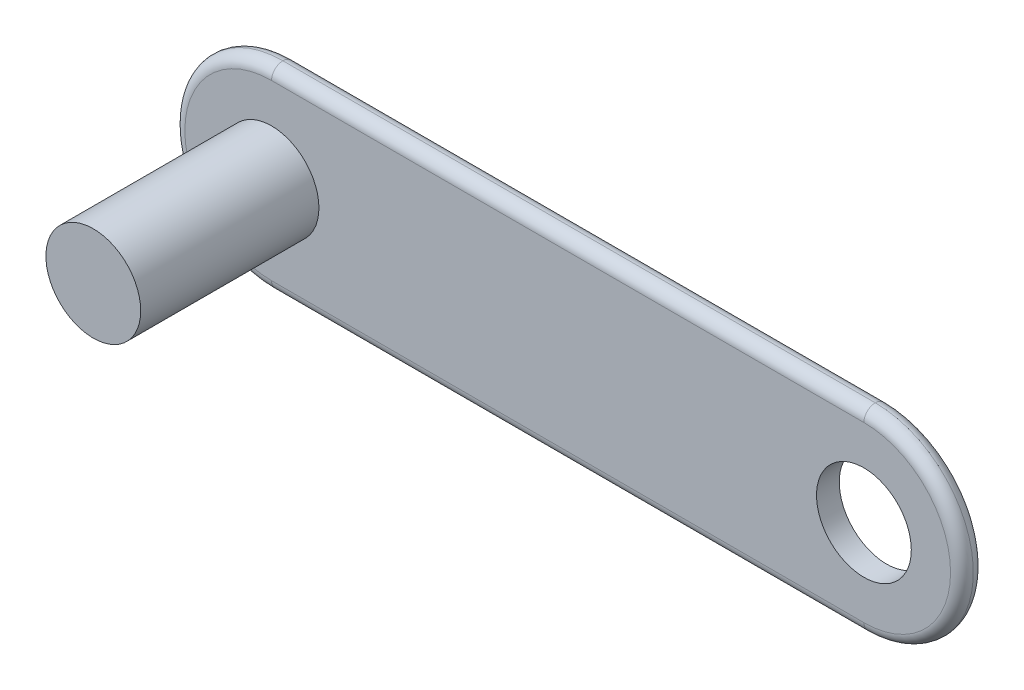
ISO-10303-21;
HEADER;
FILE_DESCRIPTION(('STEP AP214'),'2;1');
FILE_NAME('part.step','',(''),(''),'','','');
FILE_SCHEMA(('AUTOMOTIVE_DESIGN { 1 0 10303 214 1 1 1 1 }'));
ENDSEC;
DATA;
#1=APPLICATION_CONTEXT('core data for automotive mechanical design processes');
#2=APPLICATION_PROTOCOL_DEFINITION('international standard','automotive_design',2000,#1);
#3=PRODUCT_CONTEXT('',#1,'mechanical');
#4=PRODUCT('Part','Part','',(#3));
#5=PRODUCT_RELATED_PRODUCT_CATEGORY('part','',(#4));
#6=PRODUCT_DEFINITION_FORMATION('','',#4);
#7=PRODUCT_DEFINITION_CONTEXT('part definition',#1,'design');
#8=PRODUCT_DEFINITION('design','',#6,#7);
#9=PRODUCT_DEFINITION_SHAPE('','',#8);
#10=(LENGTH_UNIT() NAMED_UNIT(*) SI_UNIT(.MILLI.,.METRE.));
#11=(NAMED_UNIT(*) PLANE_ANGLE_UNIT() SI_UNIT($,.RADIAN.));
#12=(NAMED_UNIT(*) SI_UNIT($,.STERADIAN.) SOLID_ANGLE_UNIT());
#13=UNCERTAINTY_MEASURE_WITH_UNIT(LENGTH_MEASURE(1.E-05),#10,'distance_accuracy_value','');
#14=(GEOMETRIC_REPRESENTATION_CONTEXT(3) GLOBAL_UNCERTAINTY_ASSIGNED_CONTEXT((#13)) GLOBAL_UNIT_ASSIGNED_CONTEXT((#10,
#11,#12)) REPRESENTATION_CONTEXT('',''));
#15=CARTESIAN_POINT('',(0.,0.,0.));
#16=DIRECTION('',(0.,0.,1.));
#17=DIRECTION('',(1.,0.,0.));
#18=AXIS2_PLACEMENT_3D('',#15,#16,#17);
#19=CARTESIAN_POINT('',(0.,0.,1.524));
#20=DIRECTION('',(0.,0.,1.));
#21=DIRECTION('',(1.,0.,0.));
#22=AXIS2_PLACEMENT_3D('',#19,#20,#21);
#23=PLANE('',#22);
#24=CARTESIAN_POINT('',(79.3591961348812,0.,1.524));
#25=DIRECTION('',(0.,0.,1.));
#26=DIRECTION('',(1.,0.,0.));
#27=AXIS2_PLACEMENT_3D('',#24,#25,#26);
#28=CIRCLE('',#27,6.35);
#29=CARTESIAN_POINT('',(85.7091961348812,0.,1.524));
#30=VERTEX_POINT('',#29);
#31=EDGE_CURVE('E170',#30,#30,#28,.T.);
#32=ORIENTED_EDGE('',*,*,#31,.F.);
#33=EDGE_LOOP('',(#32));
#34=FACE_BOUND('',#33,.T.);
#35=CARTESIAN_POINT('',(0.,0.,1.524));
#36=DIRECTION('',(0.,0.,1.));
#37=DIRECTION('',(1.,0.,0.));
#38=AXIS2_PLACEMENT_3D('',#35,#36,#37);
#39=CIRCLE('',#38,6.35);
#40=CARTESIAN_POINT('',(6.35,0.,1.524));
#41=VERTEX_POINT('',#40);
#42=EDGE_CURVE('E43',#41,#41,#39,.F.);
#43=ORIENTED_EDGE('',*,*,#42,.T.);
#44=EDGE_LOOP('',(#43));
#45=FACE_BOUND('',#44,.T.);
#46=DIRECTION('',(1.,0.,0.));
#47=VECTOR('',#46,1.);
#48=CARTESIAN_POINT('',(79.3591961348812,-11.6113152223252,1.524));
#49=LINE('',#48,#47);
#50=CARTESIAN_POINT('',(0.,-11.6113152223252,1.524));
#51=VERTEX_POINT('',#50);
#52=CARTESIAN_POINT('',(79.3591961348812,-11.6113152223252,1.524));
#53=VERTEX_POINT('',#52);
#54=EDGE_CURVE('E50',#51,#53,#49,.T.);
#55=ORIENTED_EDGE('',*,*,#54,.T.);
#56=CARTESIAN_POINT('',(79.3591961348812,0.,1.524));
#57=DIRECTION('',(0.,0.,1.));
#58=DIRECTION('',(1.,0.,0.));
#59=AXIS2_PLACEMENT_3D('',#56,#57,#58);
#60=CIRCLE('',#59,11.6113152223252);
#61=CARTESIAN_POINT('',(79.3591961348812,11.6113152223252,1.524));
#62=VERTEX_POINT('',#61);
#63=EDGE_CURVE('E11',#53,#62,#60,.T.);
#64=ORIENTED_EDGE('',*,*,#63,.T.);
#65=DIRECTION('',(-1.,0.,0.));
#66=VECTOR('',#65,1.);
#67=CARTESIAN_POINT('',(0.,11.6113152223252,1.524));
#68=LINE('',#67,#66);
#69=CARTESIAN_POINT('',(0.,11.6113152223252,1.524));
#70=VERTEX_POINT('',#69);
#71=EDGE_CURVE('E101',#62,#70,#68,.T.);
#72=ORIENTED_EDGE('',*,*,#71,.T.);
#73=CARTESIAN_POINT('',(0.,0.,1.524));
#74=DIRECTION('',(0.,0.,1.));
#75=DIRECTION('',(1.,0.,0.));
#76=AXIS2_PLACEMENT_3D('',#73,#74,#75);
#77=CIRCLE('',#76,11.6113152223252);
#78=EDGE_CURVE('E102',#70,#51,#77,.T.);
#79=ORIENTED_EDGE('',*,*,#78,.T.);
#80=EDGE_LOOP('',(#55,#64,#72,#79));
#81=FACE_BOUND('',#80,.T.);
#82=ADVANCED_FACE('F39',(#34,#45,#81),#23,.T.);
#83=CARTESIAN_POINT('',(0.,0.,-1.524));
#84=DIRECTION('',(0.,0.,1.));
#85=DIRECTION('',(1.,0.,0.));
#86=AXIS2_PLACEMENT_3D('',#83,#84,#85);
#87=PLANE('',#86);
#88=CARTESIAN_POINT('',(79.3591961348812,0.,-1.524));
#89=DIRECTION('',(0.,0.,1.));
#90=DIRECTION('',(1.,0.,0.));
#91=AXIS2_PLACEMENT_3D('',#88,#89,#90);
#92=CIRCLE('',#91,6.35);
#93=CARTESIAN_POINT('',(85.7091961348812,0.,-1.524));
#94=VERTEX_POINT('',#93);
#95=EDGE_CURVE('E174',#94,#94,#92,.T.);
#96=ORIENTED_EDGE('',*,*,#95,.T.);
#97=EDGE_LOOP('',(#96));
#98=FACE_BOUND('',#97,.T.);
#99=DIRECTION('',(-1.,0.,0.));
#100=VECTOR('',#99,1.);
#101=CARTESIAN_POINT('',(0.,11.6113152223252,-1.524));
#102=LINE('',#101,#100);
#103=CARTESIAN_POINT('',(0.,11.6113152223252,-1.524));
#104=VERTEX_POINT('',#103);
#105=CARTESIAN_POINT('',(79.3591961348812,11.6113152223252,-1.524));
#106=VERTEX_POINT('',#105);
#107=EDGE_CURVE('E120',#104,#106,#102,.F.);
#108=ORIENTED_EDGE('',*,*,#107,.T.);
#109=CARTESIAN_POINT('',(79.3591961348812,0.,-1.524));
#110=DIRECTION('',(0.,0.,1.));
#111=DIRECTION('',(1.,0.,0.));
#112=AXIS2_PLACEMENT_3D('',#109,#110,#111);
#113=CIRCLE('',#112,11.6113152223252);
#114=CARTESIAN_POINT('',(79.3591961348812,-11.6113152223252,-1.524));
#115=VERTEX_POINT('',#114);
#116=EDGE_CURVE('E106',#106,#115,#113,.F.);
#117=ORIENTED_EDGE('',*,*,#116,.T.);
#118=DIRECTION('',(1.,0.,0.));
#119=VECTOR('',#118,1.);
#120=CARTESIAN_POINT('',(0.,-11.6113152223252,-1.524));
#121=LINE('',#120,#119);
#122=CARTESIAN_POINT('',(0.,-11.6113152223252,-1.524));
#123=VERTEX_POINT('',#122);
#124=EDGE_CURVE('E159',#115,#123,#121,.F.);
#125=ORIENTED_EDGE('',*,*,#124,.T.);
#126=CARTESIAN_POINT('',(0.,0.,-1.524));
#127=DIRECTION('',(0.,0.,1.));
#128=DIRECTION('',(1.,0.,0.));
#129=AXIS2_PLACEMENT_3D('',#126,#127,#128);
#130=CIRCLE('',#129,11.6113152223252);
#131=EDGE_CURVE('E88',#123,#104,#130,.F.);
#132=ORIENTED_EDGE('',*,*,#131,.T.);
#133=EDGE_LOOP('',(#108,#117,#125,#132));
#134=FACE_BOUND('',#133,.T.);
#135=ADVANCED_FACE('F179',(#98,#134),#87,.F.);
#136=CARTESIAN_POINT('',(0.,0.,0.));
#137=DIRECTION('',(0.,0.,1.));
#138=DIRECTION('',(1.,0.,0.));
#139=AXIS2_PLACEMENT_3D('',#136,#137,#138);
#140=TOROIDAL_SURFACE('',#139,11.6113152223252,1.524);
#141=CARTESIAN_POINT('',(0.,-11.6113152223252,0.));
#142=DIRECTION('',(1.,0.,0.));
#143=DIRECTION('',(0.,0.,-1.));
#144=AXIS2_PLACEMENT_3D('',#141,#142,#143);
#145=CIRCLE('',#144,1.524);
#146=CARTESIAN_POINT('',(0.,-13.1353152223252,0.));
#147=VERTEX_POINT('',#146);
#148=EDGE_CURVE('E80',#51,#147,#145,.T.);
#149=ORIENTED_EDGE('',*,*,#148,.F.);
#150=ORIENTED_EDGE('',*,*,#78,.F.);
#151=CARTESIAN_POINT('',(0.,11.6113152223252,0.));
#152=DIRECTION('',(1.,0.,0.));
#153=DIRECTION('',(0.,0.,-1.));
#154=AXIS2_PLACEMENT_3D('',#151,#152,#153);
#155=CIRCLE('',#154,1.524);
#156=CARTESIAN_POINT('',(0.,13.1353152223252,0.));
#157=VERTEX_POINT('',#156);
#158=EDGE_CURVE('E74',#157,#70,#155,.T.);
#159=ORIENTED_EDGE('',*,*,#158,.F.);
#160=CARTESIAN_POINT('',(0.,0.,0.));
#161=DIRECTION('',(0.,0.,1.));
#162=DIRECTION('',(1.,0.,0.));
#163=AXIS2_PLACEMENT_3D('',#160,#161,#162);
#164=CIRCLE('',#163,13.1353152223252);
#165=EDGE_CURVE('E116',#147,#157,#164,.F.);
#166=ORIENTED_EDGE('',*,*,#165,.F.);
#167=EDGE_LOOP('',(#149,#150,#159,#166));
#168=FACE_BOUND('',#167,.T.);
#169=ADVANCED_FACE('F41',(#168),#140,.T.);
#170=CARTESIAN_POINT('',(0.,-11.6113152223252,0.));
#171=DIRECTION('',(-1.,0.,0.));
#172=DIRECTION('',(0.,0.,1.));
#173=AXIS2_PLACEMENT_3D('',#170,#171,#172);
#174=CYLINDRICAL_SURFACE('',#173,1.524);
#175=ORIENTED_EDGE('',*,*,#54,.F.);
#176=ORIENTED_EDGE('',*,*,#148,.T.);
#177=DIRECTION('',(1.,0.,0.));
#178=VECTOR('',#177,1.);
#179=CARTESIAN_POINT('',(0.,-13.1353152223252,0.));
#180=LINE('',#179,#178);
#181=CARTESIAN_POINT('',(79.3591961348812,-13.1353152223252,0.));
#182=VERTEX_POINT('',#181);
#183=EDGE_CURVE('E127',#182,#147,#180,.F.);
#184=ORIENTED_EDGE('',*,*,#183,.F.);
#185=CARTESIAN_POINT('',(79.3591961348812,-11.6113152223252,0.));
#186=DIRECTION('',(1.,0.,0.));
#187=DIRECTION('',(0.,0.,-1.));
#188=AXIS2_PLACEMENT_3D('',#185,#186,#187);
#189=CIRCLE('',#188,1.524);
#190=EDGE_CURVE('E131',#53,#182,#189,.T.);
#191=ORIENTED_EDGE('',*,*,#190,.F.);
#192=EDGE_LOOP('',(#175,#176,#184,#191));
#193=FACE_BOUND('',#192,.T.);
#194=ADVANCED_FACE('F224',(#193),#174,.T.);
#195=CARTESIAN_POINT('',(0.,11.6113152223252,0.));
#196=DIRECTION('',(1.,0.,0.));
#197=DIRECTION('',(0.,0.,-1.));
#198=AXIS2_PLACEMENT_3D('',#195,#196,#197);
#199=CYLINDRICAL_SURFACE('',#198,1.524);
#200=ORIENTED_EDGE('',*,*,#158,.T.);
#201=ORIENTED_EDGE('',*,*,#71,.F.);
#202=CARTESIAN_POINT('',(79.3591961348812,11.6113152223252,0.));
#203=DIRECTION('',(1.,0.,0.));
#204=DIRECTION('',(0.,0.,-1.));
#205=AXIS2_PLACEMENT_3D('',#202,#203,#204);
#206=CIRCLE('',#205,1.524);
#207=CARTESIAN_POINT('',(79.3591961348812,13.1353152223252,0.));
#208=VERTEX_POINT('',#207);
#209=EDGE_CURVE('E135',#208,#62,#206,.T.);
#210=ORIENTED_EDGE('',*,*,#209,.F.);
#211=DIRECTION('',(-1.,0.,0.));
#212=VECTOR('',#211,1.);
#213=CARTESIAN_POINT('',(79.3591961348812,13.1353152223252,0.));
#214=LINE('',#213,#212);
#215=EDGE_CURVE('E113',#157,#208,#214,.F.);
#216=ORIENTED_EDGE('',*,*,#215,.F.);
#217=EDGE_LOOP('',(#200,#201,#210,#216));
#218=FACE_BOUND('',#217,.T.);
#219=ADVANCED_FACE('F111',(#218),#199,.T.);
#220=CARTESIAN_POINT('',(0.,0.,0.));
#221=DIRECTION('',(0.,0.,1.));
#222=DIRECTION('',(1.,0.,0.));
#223=AXIS2_PLACEMENT_3D('',#220,#221,#222);
#224=TOROIDAL_SURFACE('',#223,11.6113152223252,1.524);
#225=CARTESIAN_POINT('',(0.,11.6113152223252,0.));
#226=DIRECTION('',(1.,0.,0.));
#227=DIRECTION('',(0.,0.,-1.));
#228=AXIS2_PLACEMENT_3D('',#225,#226,#227);
#229=CIRCLE('',#228,1.524);
#230=EDGE_CURVE('E140',#104,#157,#229,.T.);
#231=ORIENTED_EDGE('',*,*,#230,.F.);
#232=ORIENTED_EDGE('',*,*,#131,.F.);
#233=CARTESIAN_POINT('',(0.,-11.6113152223252,0.));
#234=DIRECTION('',(1.,0.,0.));
#235=DIRECTION('',(0.,0.,-1.));
#236=AXIS2_PLACEMENT_3D('',#233,#234,#235);
#237=CIRCLE('',#236,1.524);
#238=EDGE_CURVE('E121',#147,#123,#237,.T.);
#239=ORIENTED_EDGE('',*,*,#238,.F.);
#240=ORIENTED_EDGE('',*,*,#165,.T.);
#241=EDGE_LOOP('',(#231,#232,#239,#240));
#242=FACE_BOUND('',#241,.T.);
#243=ADVANCED_FACE('F218',(#242),#224,.T.);
#244=CARTESIAN_POINT('',(0.,-11.6113152223252,0.));
#245=DIRECTION('',(1.,0.,0.));
#246=DIRECTION('',(0.,0.,-1.));
#247=AXIS2_PLACEMENT_3D('',#244,#245,#246);
#248=CYLINDRICAL_SURFACE('',#247,1.524);
#249=ORIENTED_EDGE('',*,*,#238,.T.);
#250=ORIENTED_EDGE('',*,*,#124,.F.);
#251=CARTESIAN_POINT('',(79.3591961348812,-11.6113152223252,0.));
#252=DIRECTION('',(1.,0.,0.));
#253=DIRECTION('',(0.,0.,-1.));
#254=AXIS2_PLACEMENT_3D('',#251,#252,#253);
#255=CIRCLE('',#254,1.524);
#256=EDGE_CURVE('E143',#182,#115,#255,.T.);
#257=ORIENTED_EDGE('',*,*,#256,.F.);
#258=ORIENTED_EDGE('',*,*,#183,.T.);
#259=EDGE_LOOP('',(#249,#250,#257,#258));
#260=FACE_BOUND('',#259,.T.);
#261=ADVANCED_FACE('F214',(#260),#248,.T.);
#262=CARTESIAN_POINT('',(79.3591961348812,0.,0.));
#263=DIRECTION('',(0.,0.,1.));
#264=DIRECTION('',(1.,0.,0.));
#265=AXIS2_PLACEMENT_3D('',#262,#263,#264);
#266=TOROIDAL_SURFACE('',#265,11.6113152223252,1.524);
#267=ORIENTED_EDGE('',*,*,#63,.F.);
#268=ORIENTED_EDGE('',*,*,#190,.T.);
#269=CARTESIAN_POINT('',(79.3591961348812,0.,0.));
#270=DIRECTION('',(0.,0.,1.));
#271=DIRECTION('',(1.,0.,0.));
#272=AXIS2_PLACEMENT_3D('',#269,#270,#271);
#273=CIRCLE('',#272,13.1353152223252);
#274=EDGE_CURVE('E146',#208,#182,#273,.F.);
#275=ORIENTED_EDGE('',*,*,#274,.F.);
#276=ORIENTED_EDGE('',*,*,#209,.T.);
#277=EDGE_LOOP('',(#267,#268,#275,#276));
#278=FACE_BOUND('',#277,.T.);
#279=ADVANCED_FACE('F210',(#278),#266,.T.);
#280=CARTESIAN_POINT('',(0.,11.6113152223252,0.));
#281=DIRECTION('',(-1.,0.,0.));
#282=DIRECTION('',(0.,0.,1.));
#283=AXIS2_PLACEMENT_3D('',#280,#281,#282);
#284=CYLINDRICAL_SURFACE('',#283,1.524);
#285=ORIENTED_EDGE('',*,*,#230,.T.);
#286=ORIENTED_EDGE('',*,*,#215,.T.);
#287=CARTESIAN_POINT('',(79.3591961348812,11.6113152223252,0.));
#288=DIRECTION('',(1.,0.,0.));
#289=DIRECTION('',(0.,0.,-1.));
#290=AXIS2_PLACEMENT_3D('',#287,#288,#289);
#291=CIRCLE('',#290,1.524);
#292=EDGE_CURVE('E150',#106,#208,#291,.T.);
#293=ORIENTED_EDGE('',*,*,#292,.F.);
#294=ORIENTED_EDGE('',*,*,#107,.F.);
#295=EDGE_LOOP('',(#285,#286,#293,#294));
#296=FACE_BOUND('',#295,.T.);
#297=ADVANCED_FACE('F206',(#296),#284,.T.);
#298=CARTESIAN_POINT('',(79.3591961348812,0.,0.));
#299=DIRECTION('',(0.,0.,1.));
#300=DIRECTION('',(1.,0.,0.));
#301=AXIS2_PLACEMENT_3D('',#298,#299,#300);
#302=TOROIDAL_SURFACE('',#301,11.6113152223252,1.524);
#303=ORIENTED_EDGE('',*,*,#256,.T.);
#304=ORIENTED_EDGE('',*,*,#116,.F.);
#305=ORIENTED_EDGE('',*,*,#292,.T.);
#306=ORIENTED_EDGE('',*,*,#274,.T.);
#307=EDGE_LOOP('',(#303,#304,#305,#306));
#308=FACE_BOUND('',#307,.T.);
#309=ADVANCED_FACE('F203',(#308),#302,.T.);
#310=CARTESIAN_POINT('',(0.,0.,25.4));
#311=DIRECTION('',(0.,0.,-1.));
#312=DIRECTION('',(-1.,0.,0.));
#313=AXIS2_PLACEMENT_3D('',#310,#311,#312);
#314=CYLINDRICAL_SURFACE('',#313,6.35);
#315=ORIENTED_EDGE('',*,*,#42,.F.);
#316=EDGE_LOOP('',(#315));
#317=FACE_BOUND('',#316,.T.);
#318=CARTESIAN_POINT('',(0.,0.,25.4));
#319=DIRECTION('',(0.,0.,1.));
#320=DIRECTION('',(1.,0.,0.));
#321=AXIS2_PLACEMENT_3D('',#318,#319,#320);
#322=CIRCLE('',#321,6.35);
#323=CARTESIAN_POINT('',(6.35,0.,25.4));
#324=VERTEX_POINT('',#323);
#325=EDGE_CURVE('E166',#324,#324,#322,.T.);
#326=ORIENTED_EDGE('',*,*,#325,.F.);
#327=EDGE_LOOP('',(#326));
#328=FACE_BOUND('',#327,.T.);
#329=ADVANCED_FACE('F189',(#317,#328),#314,.T.);
#330=CARTESIAN_POINT('',(0.,0.,25.4));
#331=DIRECTION('',(0.,0.,1.));
#332=DIRECTION('',(1.,0.,0.));
#333=AXIS2_PLACEMENT_3D('',#330,#331,#332);
#334=PLANE('',#333);
#335=ORIENTED_EDGE('',*,*,#325,.T.);
#336=EDGE_LOOP('',(#335));
#337=FACE_BOUND('',#336,.T.);
#338=ADVANCED_FACE('F183',(#337),#334,.T.);
#339=CARTESIAN_POINT('',(79.3591961348812,0.,-1.524));
#340=DIRECTION('',(0.,0.,1.));
#341=DIRECTION('',(1.,0.,0.));
#342=AXIS2_PLACEMENT_3D('',#339,#340,#341);
#343=CYLINDRICAL_SURFACE('',#342,6.35);
#344=CARTESIAN_POINT('',(85.7091961348812,0.,1.524));
#345=CARTESIAN_POINT('',(85.7091961348812,0.,1.49225));
#346=CARTESIAN_POINT('',(85.7091961348812,0.,1.4605));
#347=CARTESIAN_POINT('',(85.7091961348812,0.,1.397));
#348=CARTESIAN_POINT('',(85.7091961348812,0.,1.36525));
#349=CARTESIAN_POINT('',(85.7091961348812,0.,1.30175));
#350=CARTESIAN_POINT('',(85.7091961348812,0.,1.27));
#351=CARTESIAN_POINT('',(85.7091961348812,0.,1.2065));
#352=CARTESIAN_POINT('',(85.7091961348812,0.,1.17475));
#353=CARTESIAN_POINT('',(85.7091961348812,0.,1.11125));
#354=CARTESIAN_POINT('',(85.7091961348812,0.,1.0795));
#355=CARTESIAN_POINT('',(85.7091961348812,0.,1.016));
#356=CARTESIAN_POINT('',(85.7091961348812,0.,0.98425));
#357=CARTESIAN_POINT('',(85.7091961348812,0.,0.92075));
#358=CARTESIAN_POINT('',(85.7091961348812,0.,0.889));
#359=CARTESIAN_POINT('',(85.7091961348812,0.,0.8255));
#360=CARTESIAN_POINT('',(85.7091961348812,0.,0.79375));
#361=CARTESIAN_POINT('',(85.7091961348812,0.,0.73025));
#362=CARTESIAN_POINT('',(85.7091961348812,0.,0.6985));
#363=CARTESIAN_POINT('',(85.7091961348812,0.,0.635));
#364=CARTESIAN_POINT('',(85.7091961348812,0.,0.60325));
#365=CARTESIAN_POINT('',(85.7091961348812,0.,0.53975));
#366=CARTESIAN_POINT('',(85.7091961348812,0.,0.508));
#367=CARTESIAN_POINT('',(85.7091961348812,0.,0.4445));
#368=CARTESIAN_POINT('',(85.7091961348812,0.,0.41275));
#369=CARTESIAN_POINT('',(85.7091961348812,0.,0.34925));
#370=CARTESIAN_POINT('',(85.7091961348812,0.,0.3175));
#371=CARTESIAN_POINT('',(85.7091961348812,0.,0.254));
#372=CARTESIAN_POINT('',(85.7091961348812,0.,0.22225));
#373=CARTESIAN_POINT('',(85.7091961348812,0.,0.15875));
#374=CARTESIAN_POINT('',(85.7091961348812,0.,0.127));
#375=CARTESIAN_POINT('',(85.7091961348812,0.,0.0635000000000001));
#376=CARTESIAN_POINT('',(85.7091961348812,0.,0.03175));
#377=CARTESIAN_POINT('',(85.7091961348812,0.,-0.03175));
#378=CARTESIAN_POINT('',(85.7091961348812,0.,-0.0635000000000001));
#379=CARTESIAN_POINT('',(85.7091961348812,0.,-0.127));
#380=CARTESIAN_POINT('',(85.7091961348812,0.,-0.15875));
#381=CARTESIAN_POINT('',(85.7091961348812,0.,-0.22225));
#382=CARTESIAN_POINT('',(85.7091961348812,0.,-0.254));
#383=CARTESIAN_POINT('',(85.7091961348812,0.,-0.3175));
#384=CARTESIAN_POINT('',(85.7091961348812,0.,-0.34925));
#385=CARTESIAN_POINT('',(85.7091961348812,0.,-0.41275));
#386=CARTESIAN_POINT('',(85.7091961348812,0.,-0.4445));
#387=CARTESIAN_POINT('',(85.7091961348812,0.,-0.508));
#388=CARTESIAN_POINT('',(85.7091961348812,0.,-0.53975));
#389=CARTESIAN_POINT('',(85.7091961348812,0.,-0.60325));
#390=CARTESIAN_POINT('',(85.7091961348812,0.,-0.635));
#391=CARTESIAN_POINT('',(85.7091961348812,0.,-0.6985));
#392=CARTESIAN_POINT('',(85.7091961348812,0.,-0.73025));
#393=CARTESIAN_POINT('',(85.7091961348812,0.,-0.79375));
#394=CARTESIAN_POINT('',(85.7091961348812,0.,-0.8255));
#395=CARTESIAN_POINT('',(85.7091961348812,0.,-0.889));
#396=CARTESIAN_POINT('',(85.7091961348812,0.,-0.92075));
#397=CARTESIAN_POINT('',(85.7091961348812,0.,-0.98425));
#398=CARTESIAN_POINT('',(85.7091961348812,0.,-1.016));
#399=CARTESIAN_POINT('',(85.7091961348812,0.,-1.0795));
#400=CARTESIAN_POINT('',(85.7091961348812,0.,-1.11125));
#401=CARTESIAN_POINT('',(85.7091961348812,0.,-1.17475));
#402=CARTESIAN_POINT('',(85.7091961348812,0.,-1.2065));
#403=CARTESIAN_POINT('',(85.7091961348812,0.,-1.27));
#404=CARTESIAN_POINT('',(85.7091961348812,0.,-1.30175));
#405=CARTESIAN_POINT('',(85.7091961348812,0.,-1.36525));
#406=CARTESIAN_POINT('',(85.7091961348812,0.,-1.397));
#407=CARTESIAN_POINT('',(85.7091961348812,0.,-1.4605));
#408=CARTESIAN_POINT('',(85.7091961348812,0.,-1.49225));
#409=CARTESIAN_POINT('',(85.7091961348812,0.,-1.524));
#410=B_SPLINE_CURVE_WITH_KNOTS('',3,(#344,#345,#346,#347,#348,#349,#350,#351,#352,#353,#354,
#355,#356,#357,#358,#359,#360,#361,#362,#363,#364,#365,#366,#367,#368,#369,#370,#371,#372,#373,
#374,#375,#376,#377,#378,#379,#380,#381,#382,#383,#384,#385,#386,#387,#388,#389,#390,#391,#392,
#393,#394,#395,#396,#397,#398,#399,#400,#401,#402,#403,#404,#405,#406,#407,#408,#409),
.UNSPECIFIED.,.F.,.F.,(4,2,2,2,2,2,2,2,2,2,2,2,2,2,2,2,2,2,2,2,2,2,2,2,2,2,2,2,2,2,2,2,4),(0.,
0.0952499999999998,0.1905,0.28575,0.381,0.47625,0.5715,0.66675,0.762,0.85725,0.9525,1.04775,
1.143,1.23825,1.3335,1.42875,1.524,1.61925,1.7145,1.80975,1.905,2.00025,2.0955,2.19075,2.286,
2.38125,2.4765,2.57175,2.667,2.76225,2.8575,2.95275,3.048),.UNSPECIFIED.);
#411=EDGE_CURVE('BSEAM181',#30,#94,#410,.T.);
#412=ORIENTED_EDGE('',*,*,#31,.T.);
#413=ORIENTED_EDGE('',*,*,#95,.F.);
#414=ORIENTED_EDGE('',*,*,#411,.T.);
#415=ORIENTED_EDGE('',*,*,#411,.F.);
#416=EDGE_LOOP('',(#412,#414,#413,#415));
#417=FACE_BOUND('',#416,.T.);
#418=ADVANCED_FACE('F181',(#417),#343,.F.);
#419=CLOSED_SHELL('',(#82,#135,#169,#194,#219,#243,#261,#279,#297,#309,#329,#338,#418));
#420=MANIFOLD_SOLID_BREP('B2',#419);
#421=ADVANCED_BREP_SHAPE_REPRESENTATION('',(#18,#420),#14);
#422=SHAPE_DEFINITION_REPRESENTATION(#9,#421);
ENDSEC;
END-ISO-10303-21;
